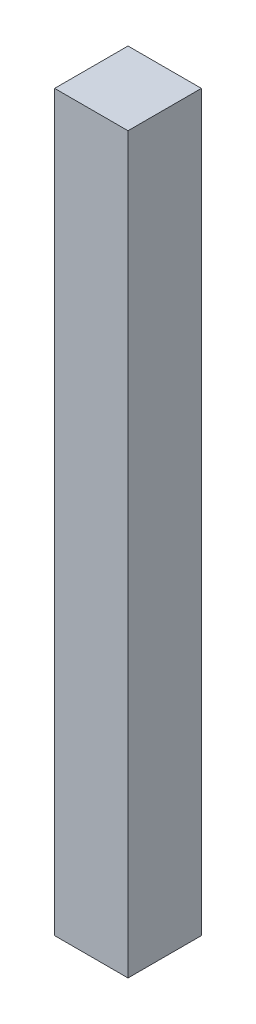
ISO-10303-21;
HEADER;
FILE_DESCRIPTION(('STEP AP214'),'2;1');
FILE_NAME('part.step','',(''),(''),'','','');
FILE_SCHEMA(('AUTOMOTIVE_DESIGN { 1 0 10303 214 1 1 1 1 }'));
ENDSEC;
DATA;
#1=APPLICATION_CONTEXT('core data for automotive mechanical design processes');
#2=APPLICATION_PROTOCOL_DEFINITION('international standard','automotive_design',2000,#1);
#3=PRODUCT_CONTEXT('',#1,'mechanical');
#4=PRODUCT('Part','Part','',(#3));
#5=PRODUCT_RELATED_PRODUCT_CATEGORY('part','',(#4));
#6=PRODUCT_DEFINITION_FORMATION('','',#4);
#7=PRODUCT_DEFINITION_CONTEXT('part definition',#1,'design');
#8=PRODUCT_DEFINITION('design','',#6,#7);
#9=PRODUCT_DEFINITION_SHAPE('','',#8);
#10=(LENGTH_UNIT() NAMED_UNIT(*) SI_UNIT(.MILLI.,.METRE.));
#11=(NAMED_UNIT(*) PLANE_ANGLE_UNIT() SI_UNIT($,.RADIAN.));
#12=(NAMED_UNIT(*) SI_UNIT($,.STERADIAN.) SOLID_ANGLE_UNIT());
#13=UNCERTAINTY_MEASURE_WITH_UNIT(LENGTH_MEASURE(1.E-05),#10,'distance_accuracy_value','');
#14=(GEOMETRIC_REPRESENTATION_CONTEXT(3) GLOBAL_UNCERTAINTY_ASSIGNED_CONTEXT((#13)) GLOBAL_UNIT_ASSIGNED_CONTEXT((#10,
#11,#12)) REPRESENTATION_CONTEXT('',''));
#15=CARTESIAN_POINT('',(0.,0.,0.));
#16=DIRECTION('',(0.,0.,1.));
#17=DIRECTION('',(1.,0.,0.));
#18=AXIS2_PLACEMENT_3D('',#15,#16,#17);
#19=CARTESIAN_POINT('',(0.,200.,20.));
#20=DIRECTION('',(1.,0.,0.));
#21=DIRECTION('',(0.,0.,-1.));
#22=AXIS2_PLACEMENT_3D('',#19,#20,#21);
#23=PLANE('',#22);
#24=DIRECTION('',(0.,0.,1.));
#25=VECTOR('',#24,1.);
#26=CARTESIAN_POINT('',(0.,0.,20.));
#27=LINE('',#26,#25);
#28=CARTESIAN_POINT('',(0.,0.,0.));
#29=VERTEX_POINT('',#28);
#30=CARTESIAN_POINT('',(0.,0.,20.));
#31=VERTEX_POINT('',#30);
#32=EDGE_CURVE('E100',#29,#31,#27,.T.);
#33=ORIENTED_EDGE('',*,*,#32,.T.);
#34=DIRECTION('',(0.,-1.,0.));
#35=VECTOR('',#34,1.);
#36=CARTESIAN_POINT('',(0.,200.,20.));
#37=LINE('',#36,#35);
#38=CARTESIAN_POINT('',(0.,200.,20.));
#39=VERTEX_POINT('',#38);
#40=EDGE_CURVE('E11',#39,#31,#37,.T.);
#41=ORIENTED_EDGE('',*,*,#40,.F.);
#42=DIRECTION('',(0.,0.,1.));
#43=VECTOR('',#42,1.);
#44=CARTESIAN_POINT('',(0.,200.,20.));
#45=LINE('',#44,#43);
#46=CARTESIAN_POINT('',(0.,200.,0.));
#47=VERTEX_POINT('',#46);
#48=EDGE_CURVE('E88',#47,#39,#45,.T.);
#49=ORIENTED_EDGE('',*,*,#48,.F.);
#50=DIRECTION('',(0.,-1.,0.));
#51=VECTOR('',#50,1.);
#52=CARTESIAN_POINT('',(0.,200.,0.));
#53=LINE('',#52,#51);
#54=EDGE_CURVE('E96',#47,#29,#53,.T.);
#55=ORIENTED_EDGE('',*,*,#54,.T.);
#56=EDGE_LOOP('',(#33,#41,#49,#55));
#57=FACE_BOUND('',#56,.T.);
#58=ADVANCED_FACE('F37',(#57),#23,.F.);
#59=CARTESIAN_POINT('',(20.,200.,20.));
#60=DIRECTION('',(0.,0.,-1.));
#61=DIRECTION('',(-1.,0.,0.));
#62=AXIS2_PLACEMENT_3D('',#59,#60,#61);
#63=PLANE('',#62);
#64=DIRECTION('',(1.,0.,0.));
#65=VECTOR('',#64,1.);
#66=CARTESIAN_POINT('',(20.,0.,20.));
#67=LINE('',#66,#65);
#68=CARTESIAN_POINT('',(20.,0.,20.));
#69=VERTEX_POINT('',#68);
#70=EDGE_CURVE('E92',#31,#69,#67,.T.);
#71=ORIENTED_EDGE('',*,*,#70,.T.);
#72=DIRECTION('',(0.,-1.,0.));
#73=VECTOR('',#72,1.);
#74=CARTESIAN_POINT('',(20.,200.,20.));
#75=LINE('',#74,#73);
#76=CARTESIAN_POINT('',(20.,200.,20.));
#77=VERTEX_POINT('',#76);
#78=EDGE_CURVE('E45',#77,#69,#75,.T.);
#79=ORIENTED_EDGE('',*,*,#78,.F.);
#80=DIRECTION('',(1.,0.,0.));
#81=VECTOR('',#80,1.);
#82=CARTESIAN_POINT('',(20.,200.,20.));
#83=LINE('',#82,#81);
#84=EDGE_CURVE('E83',#39,#77,#83,.T.);
#85=ORIENTED_EDGE('',*,*,#84,.F.);
#86=ORIENTED_EDGE('',*,*,#40,.T.);
#87=EDGE_LOOP('',(#71,#79,#85,#86));
#88=FACE_BOUND('',#87,.T.);
#89=ADVANCED_FACE('F91',(#88),#63,.F.);
#90=CARTESIAN_POINT('',(20.,200.,0.));
#91=DIRECTION('',(-1.,0.,0.));
#92=DIRECTION('',(0.,0.,1.));
#93=AXIS2_PLACEMENT_3D('',#90,#91,#92);
#94=PLANE('',#93);
#95=DIRECTION('',(0.,0.,-1.));
#96=VECTOR('',#95,1.);
#97=CARTESIAN_POINT('',(20.,0.,0.));
#98=LINE('',#97,#96);
#99=CARTESIAN_POINT('',(20.,0.,0.));
#100=VERTEX_POINT('',#99);
#101=EDGE_CURVE('E70',#69,#100,#98,.T.);
#102=ORIENTED_EDGE('',*,*,#101,.T.);
#103=DIRECTION('',(0.,-1.,0.));
#104=VECTOR('',#103,1.);
#105=CARTESIAN_POINT('',(20.,200.,0.));
#106=LINE('',#105,#104);
#107=CARTESIAN_POINT('',(20.,200.,0.));
#108=VERTEX_POINT('',#107);
#109=EDGE_CURVE('E93',#108,#100,#106,.T.);
#110=ORIENTED_EDGE('',*,*,#109,.F.);
#111=DIRECTION('',(0.,0.,-1.));
#112=VECTOR('',#111,1.);
#113=CARTESIAN_POINT('',(20.,200.,0.));
#114=LINE('',#113,#112);
#115=EDGE_CURVE('E86',#77,#108,#114,.T.);
#116=ORIENTED_EDGE('',*,*,#115,.F.);
#117=ORIENTED_EDGE('',*,*,#78,.T.);
#118=EDGE_LOOP('',(#102,#110,#116,#117));
#119=FACE_BOUND('',#118,.T.);
#120=ADVANCED_FACE('F94',(#119),#94,.F.);
#121=CARTESIAN_POINT('',(0.,200.,0.));
#122=DIRECTION('',(0.,0.,1.));
#123=DIRECTION('',(1.,0.,0.));
#124=AXIS2_PLACEMENT_3D('',#121,#122,#123);
#125=PLANE('',#124);
#126=DIRECTION('',(-1.,0.,0.));
#127=VECTOR('',#126,1.);
#128=CARTESIAN_POINT('',(0.,0.,0.));
#129=LINE('',#128,#127);
#130=EDGE_CURVE('E76',#100,#29,#129,.T.);
#131=ORIENTED_EDGE('',*,*,#130,.T.);
#132=ORIENTED_EDGE('',*,*,#54,.F.);
#133=DIRECTION('',(-1.,0.,0.));
#134=VECTOR('',#133,1.);
#135=CARTESIAN_POINT('',(0.,200.,0.));
#136=LINE('',#135,#134);
#137=EDGE_CURVE('E53',#108,#47,#136,.T.);
#138=ORIENTED_EDGE('',*,*,#137,.F.);
#139=ORIENTED_EDGE('',*,*,#109,.T.);
#140=EDGE_LOOP('',(#131,#132,#138,#139));
#141=FACE_BOUND('',#140,.T.);
#142=ADVANCED_FACE('F107',(#141),#125,.F.);
#143=CARTESIAN_POINT('',(0.,200.,0.));
#144=DIRECTION('',(0.,-1.,0.));
#145=DIRECTION('',(0.,0.,-1.));
#146=AXIS2_PLACEMENT_3D('',#143,#144,#145);
#147=PLANE('',#146);
#148=ORIENTED_EDGE('',*,*,#48,.T.);
#149=ORIENTED_EDGE('',*,*,#84,.T.);
#150=ORIENTED_EDGE('',*,*,#115,.T.);
#151=ORIENTED_EDGE('',*,*,#137,.T.);
#152=EDGE_LOOP('',(#148,#149,#150,#151));
#153=FACE_BOUND('',#152,.T.);
#154=ADVANCED_FACE('F84',(#153),#147,.F.);
#155=CARTESIAN_POINT('',(0.,0.,0.));
#156=DIRECTION('',(0.,-1.,0.));
#157=DIRECTION('',(0.,0.,-1.));
#158=AXIS2_PLACEMENT_3D('',#155,#156,#157);
#159=PLANE('',#158);
#160=ORIENTED_EDGE('',*,*,#32,.F.);
#161=ORIENTED_EDGE('',*,*,#130,.F.);
#162=ORIENTED_EDGE('',*,*,#101,.F.);
#163=ORIENTED_EDGE('',*,*,#70,.F.);
#164=EDGE_LOOP('',(#160,#161,#162,#163));
#165=FACE_BOUND('',#164,.T.);
#166=ADVANCED_FACE('F110',(#165),#159,.T.);
#167=CLOSED_SHELL('',(#58,#89,#120,#142,#154,#166));
#168=MANIFOLD_SOLID_BREP('B2',#167);
#169=ADVANCED_BREP_SHAPE_REPRESENTATION('',(#18,#168),#14);
#170=SHAPE_DEFINITION_REPRESENTATION(#9,#169);
ENDSEC;
END-ISO-10303-21;
